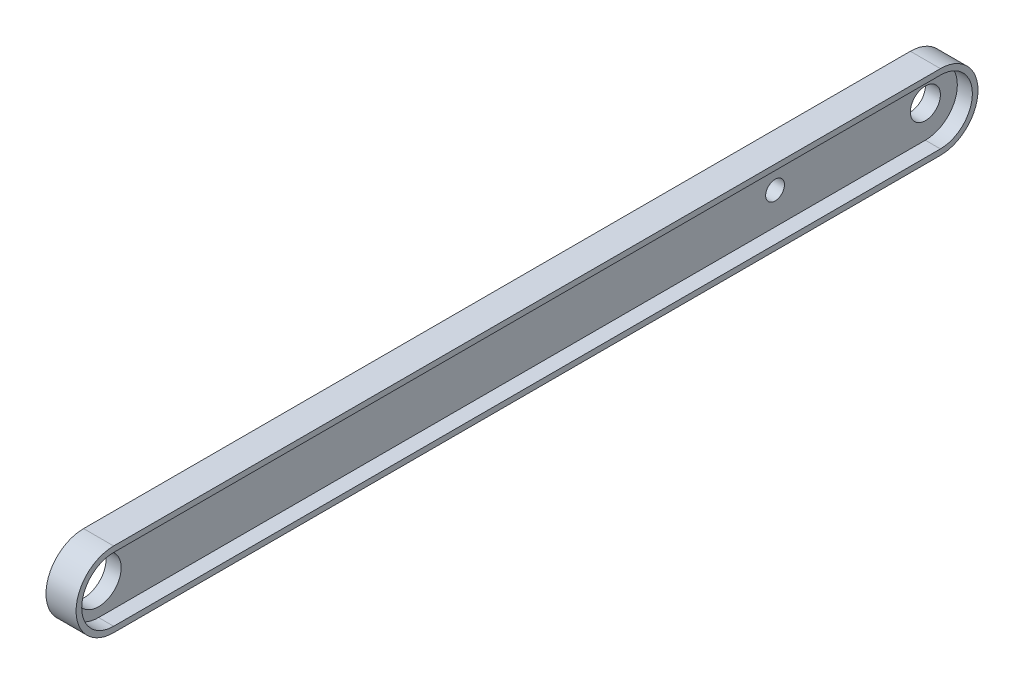
ISO-10303-21;
HEADER;
FILE_DESCRIPTION(('STEP AP214'),'2;1');
FILE_NAME('part.step','',(''),(''),'','','');
FILE_SCHEMA(('AUTOMOTIVE_DESIGN { 1 0 10303 214 1 1 1 1 }'));
ENDSEC;
DATA;
#1=APPLICATION_CONTEXT('core data for automotive mechanical design processes');
#2=APPLICATION_PROTOCOL_DEFINITION('international standard','automotive_design',2000,#1);
#3=PRODUCT_CONTEXT('',#1,'mechanical');
#4=PRODUCT('Part','Part','',(#3));
#5=PRODUCT_RELATED_PRODUCT_CATEGORY('part','',(#4));
#6=PRODUCT_DEFINITION_FORMATION('','',#4);
#7=PRODUCT_DEFINITION_CONTEXT('part definition',#1,'design');
#8=PRODUCT_DEFINITION('design','',#6,#7);
#9=PRODUCT_DEFINITION_SHAPE('','',#8);
#10=(LENGTH_UNIT() NAMED_UNIT(*) SI_UNIT(.MILLI.,.METRE.));
#11=(NAMED_UNIT(*) PLANE_ANGLE_UNIT() SI_UNIT($,.RADIAN.));
#12=(NAMED_UNIT(*) SI_UNIT($,.STERADIAN.) SOLID_ANGLE_UNIT());
#13=UNCERTAINTY_MEASURE_WITH_UNIT(LENGTH_MEASURE(1.E-05),#10,'distance_accuracy_value','');
#14=(GEOMETRIC_REPRESENTATION_CONTEXT(3) GLOBAL_UNCERTAINTY_ASSIGNED_CONTEXT((#13)) GLOBAL_UNIT_ASSIGNED_CONTEXT((#10,
#11,#12)) REPRESENTATION_CONTEXT('',''));
#15=CARTESIAN_POINT('',(0.,0.,0.));
#16=DIRECTION('',(0.,0.,1.));
#17=DIRECTION('',(1.,0.,0.));
#18=AXIS2_PLACEMENT_3D('',#15,#16,#17);
#19=CARTESIAN_POINT('',(2.,4.99999999999999,0.));
#20=DIRECTION('',(1.,0.,0.));
#21=DIRECTION('',(0.,0.,-1.));
#22=AXIS2_PLACEMENT_3D('',#19,#20,#21);
#23=PLANE('',#22);
#24=CARTESIAN_POINT('',(2.,5.,0.));
#25=DIRECTION('',(1.,0.,0.));
#26=DIRECTION('',(0.,0.,-1.));
#27=AXIS2_PLACEMENT_3D('',#24,#25,#26);
#28=CIRCLE('',#27,4.25);
#29=CARTESIAN_POINT('',(2.,9.25,0.));
#30=VERTEX_POINT('',#29);
#31=CARTESIAN_POINT('',(2.,0.75,0.));
#32=VERTEX_POINT('',#31);
#33=EDGE_CURVE('E62',#30,#32,#28,.T.);
#34=ORIENTED_EDGE('',*,*,#33,.T.);
#35=DIRECTION('',(0.,0.,-1.));
#36=VECTOR('',#35,1.);
#37=CARTESIAN_POINT('',(2.,0.75,0.));
#38=LINE('',#37,#36);
#39=CARTESIAN_POINT('',(2.,0.750000000000001,-110.));
#40=VERTEX_POINT('',#39);
#41=EDGE_CURVE('E66',#32,#40,#38,.T.);
#42=ORIENTED_EDGE('',*,*,#41,.T.);
#43=CARTESIAN_POINT('',(2.,5.,-110.));
#44=DIRECTION('',(1.,0.,0.));
#45=DIRECTION('',(0.,0.,1.));
#46=AXIS2_PLACEMENT_3D('',#43,#44,#45);
#47=CIRCLE('',#46,4.25);
#48=CARTESIAN_POINT('',(2.,9.25,-110.));
#49=VERTEX_POINT('',#48);
#50=EDGE_CURVE('E140',#40,#49,#47,.T.);
#51=ORIENTED_EDGE('',*,*,#50,.T.);
#52=DIRECTION('',(0.,0.,1.));
#53=VECTOR('',#52,1.);
#54=CARTESIAN_POINT('',(2.,9.25,0.));
#55=LINE('',#54,#53);
#56=EDGE_CURVE('E121',#49,#30,#55,.T.);
#57=ORIENTED_EDGE('',*,*,#56,.T.);
#58=EDGE_LOOP('',(#34,#42,#51,#57));
#59=FACE_BOUND('',#58,.T.);
#60=CARTESIAN_POINT('',(2.,4.99999999999999,0.));
#61=DIRECTION('',(1.,0.,0.));
#62=DIRECTION('',(0.,0.,-1.));
#63=AXIS2_PLACEMENT_3D('',#60,#61,#62);
#64=CIRCLE('',#63,3.);
#65=CARTESIAN_POINT('',(2.,4.99999999999999,-3.));
#66=VERTEX_POINT('',#65);
#67=EDGE_CURVE('E166',#66,#66,#64,.T.);
#68=ORIENTED_EDGE('',*,*,#67,.F.);
#69=EDGE_LOOP('',(#68));
#70=FACE_BOUND('',#69,.T.);
#71=CARTESIAN_POINT('',(2.,5.,-110.));
#72=DIRECTION('',(1.,0.,0.));
#73=DIRECTION('',(0.,0.,-1.));
#74=AXIS2_PLACEMENT_3D('',#71,#72,#73);
#75=CIRCLE('',#74,2.);
#76=CARTESIAN_POINT('',(2.,5.,-112.));
#77=VERTEX_POINT('',#76);
#78=EDGE_CURVE('E172',#77,#77,#75,.T.);
#79=ORIENTED_EDGE('',*,*,#78,.F.);
#80=EDGE_LOOP('',(#79));
#81=FACE_BOUND('',#80,.T.);
#82=CARTESIAN_POINT('',(2.,5.,-90.));
#83=DIRECTION('',(1.,0.,0.));
#84=DIRECTION('',(0.,0.,-1.));
#85=AXIS2_PLACEMENT_3D('',#82,#83,#84);
#86=CIRCLE('',#85,1.25);
#87=CARTESIAN_POINT('',(2.,5.,-91.25));
#88=VERTEX_POINT('',#87);
#89=EDGE_CURVE('E160',#88,#88,#86,.T.);
#90=ORIENTED_EDGE('',*,*,#89,.F.);
#91=EDGE_LOOP('',(#90));
#92=FACE_BOUND('',#91,.T.);
#93=ADVANCED_FACE('F47',(#59,#70,#81,#92),#23,.T.);
#94=CARTESIAN_POINT('',(0.,4.99999999999999,0.));
#95=DIRECTION('',(1.,0.,0.));
#96=DIRECTION('',(0.,0.,-1.));
#97=AXIS2_PLACEMENT_3D('',#94,#95,#96);
#98=PLANE('',#97);
#99=CARTESIAN_POINT('',(0.,4.99999999999999,0.));
#100=DIRECTION('',(1.,0.,0.));
#101=DIRECTION('',(0.,0.,-1.));
#102=AXIS2_PLACEMENT_3D('',#99,#100,#101);
#103=CIRCLE('',#102,5.);
#104=CARTESIAN_POINT('',(0.,10.,0.));
#105=VERTEX_POINT('',#104);
#106=CARTESIAN_POINT('',(0.,0.,0.));
#107=VERTEX_POINT('',#106);
#108=EDGE_CURVE('E175',#105,#107,#103,.T.);
#109=ORIENTED_EDGE('',*,*,#108,.F.);
#110=DIRECTION('',(0.,0.,1.));
#111=VECTOR('',#110,1.);
#112=CARTESIAN_POINT('',(0.,10.,0.));
#113=LINE('',#112,#111);
#114=CARTESIAN_POINT('',(0.,10.,-110.));
#115=VERTEX_POINT('',#114);
#116=EDGE_CURVE('E184',#115,#105,#113,.T.);
#117=ORIENTED_EDGE('',*,*,#116,.F.);
#118=CARTESIAN_POINT('',(0.,5.,-110.));
#119=DIRECTION('',(1.,0.,0.));
#120=DIRECTION('',(0.,0.,1.));
#121=AXIS2_PLACEMENT_3D('',#118,#119,#120);
#122=CIRCLE('',#121,5.);
#123=CARTESIAN_POINT('',(0.,0.,-110.));
#124=VERTEX_POINT('',#123);
#125=EDGE_CURVE('E182',#124,#115,#122,.T.);
#126=ORIENTED_EDGE('',*,*,#125,.F.);
#127=DIRECTION('',(0.,0.,-1.));
#128=VECTOR('',#127,1.);
#129=CARTESIAN_POINT('',(0.,0.,0.));
#130=LINE('',#129,#128);
#131=EDGE_CURVE('E180',#107,#124,#130,.T.);
#132=ORIENTED_EDGE('',*,*,#131,.F.);
#133=EDGE_LOOP('',(#109,#117,#126,#132));
#134=FACE_BOUND('',#133,.T.);
#135=CARTESIAN_POINT('',(0.,5.,-110.));
#136=DIRECTION('',(1.,0.,0.));
#137=DIRECTION('',(0.,0.,-1.));
#138=AXIS2_PLACEMENT_3D('',#135,#136,#137);
#139=CIRCLE('',#138,2.);
#140=CARTESIAN_POINT('',(0.,5.,-112.));
#141=VERTEX_POINT('',#140);
#142=EDGE_CURVE('E169',#141,#141,#139,.T.);
#143=ORIENTED_EDGE('',*,*,#142,.T.);
#144=EDGE_LOOP('',(#143));
#145=FACE_BOUND('',#144,.T.);
#146=CARTESIAN_POINT('',(0.,4.99999999999999,0.));
#147=DIRECTION('',(1.,0.,0.));
#148=DIRECTION('',(0.,0.,-1.));
#149=AXIS2_PLACEMENT_3D('',#146,#147,#148);
#150=CIRCLE('',#149,3.);
#151=CARTESIAN_POINT('',(0.,4.99999999999999,-3.));
#152=VERTEX_POINT('',#151);
#153=EDGE_CURVE('E163',#152,#152,#150,.T.);
#154=ORIENTED_EDGE('',*,*,#153,.T.);
#155=EDGE_LOOP('',(#154));
#156=FACE_BOUND('',#155,.T.);
#157=CARTESIAN_POINT('',(0.,5.,-90.));
#158=DIRECTION('',(1.,0.,0.));
#159=DIRECTION('',(0.,0.,-1.));
#160=AXIS2_PLACEMENT_3D('',#157,#158,#159);
#161=CIRCLE('',#160,1.25);
#162=CARTESIAN_POINT('',(0.,5.,-91.25));
#163=VERTEX_POINT('',#162);
#164=EDGE_CURVE('E159',#163,#163,#161,.T.);
#165=ORIENTED_EDGE('',*,*,#164,.T.);
#166=EDGE_LOOP('',(#165));
#167=FACE_BOUND('',#166,.T.);
#168=ADVANCED_FACE('F201',(#134,#145,#156,#167),#98,.F.);
#169=CARTESIAN_POINT('',(2.,4.99999999999999,0.));
#170=DIRECTION('',(-1.,0.,0.));
#171=DIRECTION('',(0.,0.,1.));
#172=AXIS2_PLACEMENT_3D('',#169,#170,#171);
#173=CYLINDRICAL_SURFACE('',#172,5.);
#174=ORIENTED_EDGE('',*,*,#108,.T.);
#175=DIRECTION('',(-1.,0.,0.));
#176=VECTOR('',#175,1.);
#177=CARTESIAN_POINT('',(2.,0.,0.));
#178=LINE('',#177,#176);
#179=CARTESIAN_POINT('',(4.,0.,0.));
#180=VERTEX_POINT('',#179);
#181=EDGE_CURVE('E13',#180,#107,#178,.T.);
#182=ORIENTED_EDGE('',*,*,#181,.F.);
#183=CARTESIAN_POINT('',(4.,5.,0.));
#184=DIRECTION('',(1.,0.,0.));
#185=DIRECTION('',(0.,0.,-1.));
#186=AXIS2_PLACEMENT_3D('',#183,#184,#185);
#187=CIRCLE('',#186,5.);
#188=CARTESIAN_POINT('',(4.,10.,0.));
#189=VERTEX_POINT('',#188);
#190=EDGE_CURVE('E126',#189,#180,#187,.T.);
#191=ORIENTED_EDGE('',*,*,#190,.F.);
#192=DIRECTION('',(-1.,0.,0.));
#193=VECTOR('',#192,1.);
#194=CARTESIAN_POINT('',(2.,10.,0.));
#195=LINE('',#194,#193);
#196=EDGE_CURVE('E186',#189,#105,#195,.T.);
#197=ORIENTED_EDGE('',*,*,#196,.T.);
#198=EDGE_LOOP('',(#174,#182,#191,#197));
#199=FACE_BOUND('',#198,.T.);
#200=ADVANCED_FACE('F49',(#199),#173,.T.);
#201=CARTESIAN_POINT('',(2.,0.,0.));
#202=DIRECTION('',(0.,1.,0.));
#203=DIRECTION('',(0.,0.,1.));
#204=AXIS2_PLACEMENT_3D('',#201,#202,#203);
#205=PLANE('',#204);
#206=ORIENTED_EDGE('',*,*,#131,.T.);
#207=DIRECTION('',(-1.,0.,0.));
#208=VECTOR('',#207,1.);
#209=CARTESIAN_POINT('',(2.,0.,-110.));
#210=LINE('',#209,#208);
#211=CARTESIAN_POINT('',(4.,0.,-110.));
#212=VERTEX_POINT('',#211);
#213=EDGE_CURVE('E55',#212,#124,#210,.T.);
#214=ORIENTED_EDGE('',*,*,#213,.F.);
#215=DIRECTION('',(0.,0.,-1.));
#216=VECTOR('',#215,1.);
#217=CARTESIAN_POINT('',(4.,0.,0.));
#218=LINE('',#217,#216);
#219=EDGE_CURVE('E150',#180,#212,#218,.T.);
#220=ORIENTED_EDGE('',*,*,#219,.F.);
#221=ORIENTED_EDGE('',*,*,#181,.T.);
#222=EDGE_LOOP('',(#206,#214,#220,#221));
#223=FACE_BOUND('',#222,.T.);
#224=ADVANCED_FACE('F209',(#223),#205,.F.);
#225=CARTESIAN_POINT('',(2.,5.,-110.));
#226=DIRECTION('',(-1.,0.,0.));
#227=DIRECTION('',(0.,0.,1.));
#228=AXIS2_PLACEMENT_3D('',#225,#226,#227);
#229=CYLINDRICAL_SURFACE('',#228,5.);
#230=ORIENTED_EDGE('',*,*,#125,.T.);
#231=DIRECTION('',(-1.,0.,0.));
#232=VECTOR('',#231,1.);
#233=CARTESIAN_POINT('',(2.,10.,-110.));
#234=LINE('',#233,#232);
#235=CARTESIAN_POINT('',(4.,10.,-110.));
#236=VERTEX_POINT('',#235);
#237=EDGE_CURVE('E189',#236,#115,#234,.T.);
#238=ORIENTED_EDGE('',*,*,#237,.F.);
#239=CARTESIAN_POINT('',(4.,5.,-110.));
#240=DIRECTION('',(1.,0.,0.));
#241=DIRECTION('',(0.,0.,1.));
#242=AXIS2_PLACEMENT_3D('',#239,#240,#241);
#243=CIRCLE('',#242,5.);
#244=EDGE_CURVE('E153',#212,#236,#243,.T.);
#245=ORIENTED_EDGE('',*,*,#244,.F.);
#246=ORIENTED_EDGE('',*,*,#213,.T.);
#247=EDGE_LOOP('',(#230,#238,#245,#246));
#248=FACE_BOUND('',#247,.T.);
#249=ADVANCED_FACE('F195',(#248),#229,.T.);
#250=CARTESIAN_POINT('',(2.,10.,0.));
#251=DIRECTION('',(0.,-1.,0.));
#252=DIRECTION('',(0.,0.,-1.));
#253=AXIS2_PLACEMENT_3D('',#250,#251,#252);
#254=PLANE('',#253);
#255=ORIENTED_EDGE('',*,*,#116,.T.);
#256=ORIENTED_EDGE('',*,*,#196,.F.);
#257=DIRECTION('',(0.,0.,1.));
#258=VECTOR('',#257,1.);
#259=CARTESIAN_POINT('',(4.,10.,-110.));
#260=LINE('',#259,#258);
#261=EDGE_CURVE('E156',#236,#189,#260,.T.);
#262=ORIENTED_EDGE('',*,*,#261,.F.);
#263=ORIENTED_EDGE('',*,*,#237,.T.);
#264=EDGE_LOOP('',(#255,#256,#262,#263));
#265=FACE_BOUND('',#264,.T.);
#266=ADVANCED_FACE('F204',(#265),#254,.F.);
#267=CARTESIAN_POINT('',(2.,5.,-110.));
#268=DIRECTION('',(-1.,0.,0.));
#269=DIRECTION('',(0.,0.,1.));
#270=AXIS2_PLACEMENT_3D('',#267,#268,#269);
#271=CYLINDRICAL_SURFACE('',#270,2.);
#272=ORIENTED_EDGE('',*,*,#78,.T.);
#273=EDGE_LOOP('',(#272));
#274=FACE_BOUND('',#273,.T.);
#275=ORIENTED_EDGE('',*,*,#142,.F.);
#276=EDGE_LOOP('',(#275));
#277=FACE_BOUND('',#276,.T.);
#278=ADVANCED_FACE('F224',(#274,#277),#271,.F.);
#279=CARTESIAN_POINT('',(2.,4.99999999999999,0.));
#280=DIRECTION('',(-1.,0.,0.));
#281=DIRECTION('',(0.,0.,1.));
#282=AXIS2_PLACEMENT_3D('',#279,#280,#281);
#283=CYLINDRICAL_SURFACE('',#282,3.);
#284=ORIENTED_EDGE('',*,*,#67,.T.);
#285=EDGE_LOOP('',(#284));
#286=FACE_BOUND('',#285,.T.);
#287=ORIENTED_EDGE('',*,*,#153,.F.);
#288=EDGE_LOOP('',(#287));
#289=FACE_BOUND('',#288,.T.);
#290=ADVANCED_FACE('F231',(#286,#289),#283,.F.);
#291=CARTESIAN_POINT('',(2.,5.,-90.));
#292=DIRECTION('',(-1.,0.,0.));
#293=DIRECTION('',(0.,0.,1.));
#294=AXIS2_PLACEMENT_3D('',#291,#292,#293);
#295=CYLINDRICAL_SURFACE('',#294,1.25);
#296=ORIENTED_EDGE('',*,*,#89,.T.);
#297=EDGE_LOOP('',(#296));
#298=FACE_BOUND('',#297,.T.);
#299=ORIENTED_EDGE('',*,*,#164,.F.);
#300=EDGE_LOOP('',(#299));
#301=FACE_BOUND('',#300,.T.);
#302=ADVANCED_FACE('F236',(#298,#301),#295,.F.);
#303=CARTESIAN_POINT('',(4.,5.,0.));
#304=DIRECTION('',(1.,0.,0.));
#305=DIRECTION('',(0.,0.,-1.));
#306=AXIS2_PLACEMENT_3D('',#303,#304,#305);
#307=PLANE('',#306);
#308=ORIENTED_EDGE('',*,*,#190,.T.);
#309=ORIENTED_EDGE('',*,*,#219,.T.);
#310=ORIENTED_EDGE('',*,*,#244,.T.);
#311=ORIENTED_EDGE('',*,*,#261,.T.);
#312=EDGE_LOOP('',(#308,#309,#310,#311));
#313=FACE_BOUND('',#312,.T.);
#314=DIRECTION('',(0.,0.,-1.));
#315=VECTOR('',#314,1.);
#316=CARTESIAN_POINT('',(4.,0.75,0.));
#317=LINE('',#316,#315);
#318=CARTESIAN_POINT('',(4.,0.75,0.));
#319=VERTEX_POINT('',#318);
#320=CARTESIAN_POINT('',(4.,0.750000000000001,-110.));
#321=VERTEX_POINT('',#320);
#322=EDGE_CURVE('E120',#319,#321,#317,.T.);
#323=ORIENTED_EDGE('',*,*,#322,.F.);
#324=CARTESIAN_POINT('',(4.,5.,0.));
#325=DIRECTION('',(1.,0.,0.));
#326=DIRECTION('',(0.,0.,-1.));
#327=AXIS2_PLACEMENT_3D('',#324,#325,#326);
#328=CIRCLE('',#327,4.25);
#329=CARTESIAN_POINT('',(4.,9.25,0.));
#330=VERTEX_POINT('',#329);
#331=EDGE_CURVE('E111',#330,#319,#328,.T.);
#332=ORIENTED_EDGE('',*,*,#331,.F.);
#333=DIRECTION('',(0.,0.,1.));
#334=VECTOR('',#333,1.);
#335=CARTESIAN_POINT('',(4.,9.25,0.));
#336=LINE('',#335,#334);
#337=CARTESIAN_POINT('',(4.,9.25,-110.));
#338=VERTEX_POINT('',#337);
#339=EDGE_CURVE('E134',#338,#330,#336,.T.);
#340=ORIENTED_EDGE('',*,*,#339,.F.);
#341=CARTESIAN_POINT('',(4.,5.,-110.));
#342=DIRECTION('',(1.,0.,0.));
#343=DIRECTION('',(0.,0.,1.));
#344=AXIS2_PLACEMENT_3D('',#341,#342,#343);
#345=CIRCLE('',#344,4.25);
#346=EDGE_CURVE('E132',#321,#338,#345,.T.);
#347=ORIENTED_EDGE('',*,*,#346,.F.);
#348=EDGE_LOOP('',(#323,#332,#340,#347));
#349=FACE_BOUND('',#348,.T.);
#350=ADVANCED_FACE('F130',(#313,#349),#307,.T.);
#351=CARTESIAN_POINT('',(4.,5.,0.));
#352=DIRECTION('',(-1.,0.,0.));
#353=DIRECTION('',(0.,0.,1.));
#354=AXIS2_PLACEMENT_3D('',#351,#352,#353);
#355=CYLINDRICAL_SURFACE('',#354,4.25);
#356=ORIENTED_EDGE('',*,*,#33,.F.);
#357=DIRECTION('',(-1.,0.,0.));
#358=VECTOR('',#357,1.);
#359=CARTESIAN_POINT('',(4.,9.25,0.));
#360=LINE('',#359,#358);
#361=EDGE_CURVE('E116',#330,#30,#360,.T.);
#362=ORIENTED_EDGE('',*,*,#361,.F.);
#363=ORIENTED_EDGE('',*,*,#331,.T.);
#364=DIRECTION('',(-1.,0.,0.));
#365=VECTOR('',#364,1.);
#366=CARTESIAN_POINT('',(4.,0.75,0.));
#367=LINE('',#366,#365);
#368=EDGE_CURVE('E114',#319,#32,#367,.T.);
#369=ORIENTED_EDGE('',*,*,#368,.T.);
#370=EDGE_LOOP('',(#356,#362,#363,#369));
#371=FACE_BOUND('',#370,.T.);
#372=ADVANCED_FACE('F113',(#371),#355,.F.);
#373=CARTESIAN_POINT('',(4.,0.75,0.));
#374=DIRECTION('',(0.,1.,0.));
#375=DIRECTION('',(0.,0.,1.));
#376=AXIS2_PLACEMENT_3D('',#373,#374,#375);
#377=PLANE('',#376);
#378=ORIENTED_EDGE('',*,*,#41,.F.);
#379=ORIENTED_EDGE('',*,*,#368,.F.);
#380=ORIENTED_EDGE('',*,*,#322,.T.);
#381=DIRECTION('',(-1.,0.,0.));
#382=VECTOR('',#381,1.);
#383=CARTESIAN_POINT('',(4.,0.750000000000001,-110.));
#384=LINE('',#383,#382);
#385=EDGE_CURVE('E127',#321,#40,#384,.T.);
#386=ORIENTED_EDGE('',*,*,#385,.T.);
#387=EDGE_LOOP('',(#378,#379,#380,#386));
#388=FACE_BOUND('',#387,.T.);
#389=ADVANCED_FACE('F124',(#388),#377,.T.);
#390=CARTESIAN_POINT('',(4.,5.,-110.));
#391=DIRECTION('',(-1.,0.,0.));
#392=DIRECTION('',(0.,0.,1.));
#393=AXIS2_PLACEMENT_3D('',#390,#391,#392);
#394=CYLINDRICAL_SURFACE('',#393,4.25);
#395=ORIENTED_EDGE('',*,*,#50,.F.);
#396=ORIENTED_EDGE('',*,*,#385,.F.);
#397=ORIENTED_EDGE('',*,*,#346,.T.);
#398=DIRECTION('',(-1.,0.,0.));
#399=VECTOR('',#398,1.);
#400=CARTESIAN_POINT('',(4.,9.25,-110.));
#401=LINE('',#400,#399);
#402=EDGE_CURVE('E144',#338,#49,#401,.T.);
#403=ORIENTED_EDGE('',*,*,#402,.T.);
#404=EDGE_LOOP('',(#395,#396,#397,#403));
#405=FACE_BOUND('',#404,.T.);
#406=ADVANCED_FACE('F258',(#405),#394,.F.);
#407=CARTESIAN_POINT('',(4.,9.25,0.));
#408=DIRECTION('',(0.,-1.,0.));
#409=DIRECTION('',(0.,0.,-1.));
#410=AXIS2_PLACEMENT_3D('',#407,#408,#409);
#411=PLANE('',#410);
#412=ORIENTED_EDGE('',*,*,#56,.F.);
#413=ORIENTED_EDGE('',*,*,#402,.F.);
#414=ORIENTED_EDGE('',*,*,#339,.T.);
#415=ORIENTED_EDGE('',*,*,#361,.T.);
#416=EDGE_LOOP('',(#412,#413,#414,#415));
#417=FACE_BOUND('',#416,.T.);
#418=ADVANCED_FACE('F261',(#417),#411,.T.);
#419=CLOSED_SHELL('',(#93,#168,#200,#224,#249,#266,#278,#290,#302,#350,#372,#389,#406,#418));
#420=MANIFOLD_SOLID_BREP('B2',#419);
#421=ADVANCED_BREP_SHAPE_REPRESENTATION('',(#18,#420),#14);
#422=SHAPE_DEFINITION_REPRESENTATION(#9,#421);
ENDSEC;
END-ISO-10303-21;
